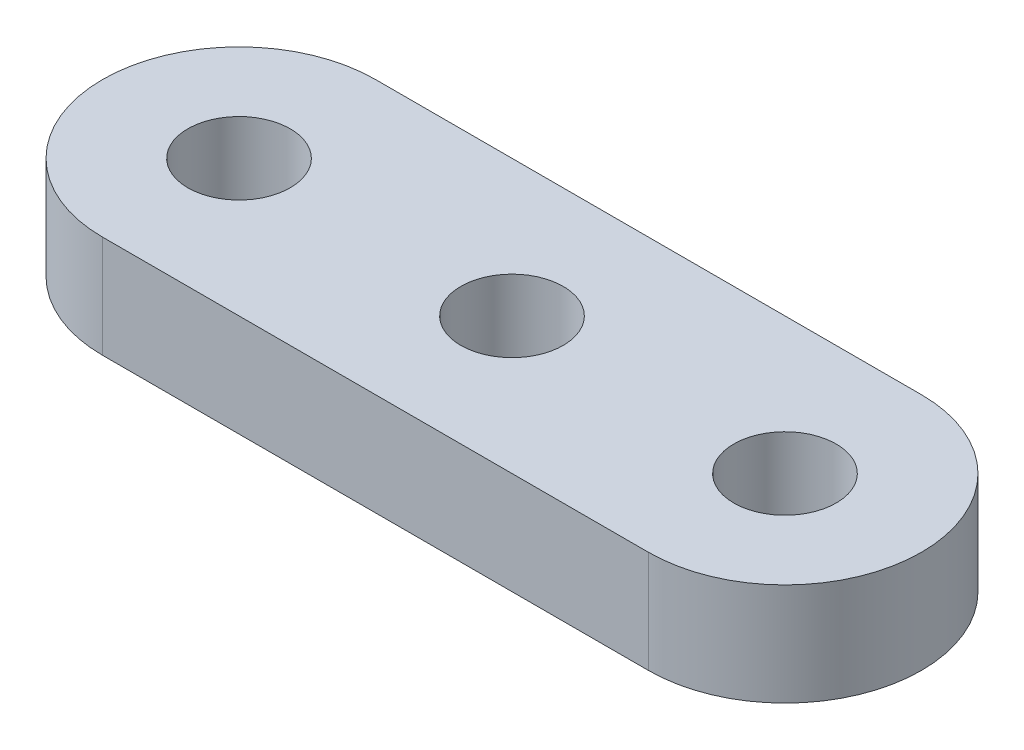
ISO-10303-21;
HEADER;
FILE_DESCRIPTION(('STEP AP214'),'2;1');
FILE_NAME('part.step','',(''),(''),'','','');
FILE_SCHEMA(('AUTOMOTIVE_DESIGN { 1 0 10303 214 1 1 1 1 }'));
ENDSEC;
DATA;
#1=APPLICATION_CONTEXT('core data for automotive mechanical design processes');
#2=APPLICATION_PROTOCOL_DEFINITION('international standard','automotive_design',2000,#1);
#3=PRODUCT_CONTEXT('',#1,'mechanical');
#4=PRODUCT('Part','Part','',(#3));
#5=PRODUCT_RELATED_PRODUCT_CATEGORY('part','',(#4));
#6=PRODUCT_DEFINITION_FORMATION('','',#4);
#7=PRODUCT_DEFINITION_CONTEXT('part definition',#1,'design');
#8=PRODUCT_DEFINITION('design','',#6,#7);
#9=PRODUCT_DEFINITION_SHAPE('','',#8);
#10=(LENGTH_UNIT() NAMED_UNIT(*) SI_UNIT(.MILLI.,.METRE.));
#11=(NAMED_UNIT(*) PLANE_ANGLE_UNIT() SI_UNIT($,.RADIAN.));
#12=(NAMED_UNIT(*) SI_UNIT($,.STERADIAN.) SOLID_ANGLE_UNIT());
#13=UNCERTAINTY_MEASURE_WITH_UNIT(LENGTH_MEASURE(1.E-05),#10,'distance_accuracy_value','');
#14=(GEOMETRIC_REPRESENTATION_CONTEXT(3) GLOBAL_UNCERTAINTY_ASSIGNED_CONTEXT((#13)) GLOBAL_UNIT_ASSIGNED_CONTEXT((#10,
#11,#12)) REPRESENTATION_CONTEXT('',''));
#15=CARTESIAN_POINT('',(0.,0.,0.));
#16=DIRECTION('',(0.,0.,1.));
#17=DIRECTION('',(1.,0.,0.));
#18=AXIS2_PLACEMENT_3D('',#15,#16,#17);
#19=CARTESIAN_POINT('',(0.,3.,0.));
#20=DIRECTION('',(0.,1.,0.));
#21=DIRECTION('',(0.,0.,1.));
#22=AXIS2_PLACEMENT_3D('',#19,#20,#21);
#23=PLANE('',#22);
#24=CARTESIAN_POINT('',(8.00000000000001,3.,0.));
#25=DIRECTION('',(0.,1.,0.));
#26=DIRECTION('',(0.,0.,1.));
#27=AXIS2_PLACEMENT_3D('',#24,#25,#26);
#28=CIRCLE('',#27,1.5);
#29=CARTESIAN_POINT('',(8.00000000000001,3.,1.5));
#30=VERTEX_POINT('',#29);
#31=EDGE_CURVE('E128',#30,#30,#28,.T.);
#32=ORIENTED_EDGE('',*,*,#31,.F.);
#33=EDGE_LOOP('',(#32));
#34=FACE_BOUND('',#33,.T.);
#35=CARTESIAN_POINT('',(0.,3.,0.));
#36=DIRECTION('',(0.,1.,0.));
#37=DIRECTION('',(0.,0.,1.));
#38=AXIS2_PLACEMENT_3D('',#35,#36,#37);
#39=CIRCLE('',#38,4.);
#40=CARTESIAN_POINT('',(0.,3.,-4.));
#41=VERTEX_POINT('',#40);
#42=CARTESIAN_POINT('',(0.,3.,4.));
#43=VERTEX_POINT('',#42);
#44=EDGE_CURVE('E98',#41,#43,#39,.T.);
#45=ORIENTED_EDGE('',*,*,#44,.T.);
#46=DIRECTION('',(1.,0.,0.));
#47=VECTOR('',#46,1.);
#48=CARTESIAN_POINT('',(0.,3.,4.));
#49=LINE('',#48,#47);
#50=CARTESIAN_POINT('',(16.,3.,4.));
#51=VERTEX_POINT('',#50);
#52=EDGE_CURVE('E93',#43,#51,#49,.T.);
#53=ORIENTED_EDGE('',*,*,#52,.T.);
#54=CARTESIAN_POINT('',(16.,3.,0.));
#55=DIRECTION('',(0.,1.,0.));
#56=DIRECTION('',(0.,0.,1.));
#57=AXIS2_PLACEMENT_3D('',#54,#55,#56);
#58=CIRCLE('',#57,4.);
#59=CARTESIAN_POINT('',(16.,3.,-4.));
#60=VERTEX_POINT('',#59);
#61=EDGE_CURVE('E96',#51,#60,#58,.T.);
#62=ORIENTED_EDGE('',*,*,#61,.T.);
#63=DIRECTION('',(-1.,0.,0.));
#64=VECTOR('',#63,1.);
#65=CARTESIAN_POINT('',(0.,3.,-4.));
#66=LINE('',#65,#64);
#67=EDGE_CURVE('E63',#60,#41,#66,.T.);
#68=ORIENTED_EDGE('',*,*,#67,.T.);
#69=EDGE_LOOP('',(#45,#53,#62,#68));
#70=FACE_BOUND('',#69,.T.);
#71=CARTESIAN_POINT('',(0.,3.,0.));
#72=DIRECTION('',(0.,1.,0.));
#73=DIRECTION('',(0.,0.,1.));
#74=AXIS2_PLACEMENT_3D('',#71,#72,#73);
#75=CIRCLE('',#74,1.5);
#76=CARTESIAN_POINT('',(0.,3.,1.5));
#77=VERTEX_POINT('',#76);
#78=EDGE_CURVE('E113',#77,#77,#75,.T.);
#79=ORIENTED_EDGE('',*,*,#78,.F.);
#80=EDGE_LOOP('',(#79));
#81=FACE_BOUND('',#80,.T.);
#82=CARTESIAN_POINT('',(16.,3.,0.));
#83=DIRECTION('',(0.,1.,0.));
#84=DIRECTION('',(0.,0.,1.));
#85=AXIS2_PLACEMENT_3D('',#82,#83,#84);
#86=CIRCLE('',#85,1.5);
#87=CARTESIAN_POINT('',(16.,3.,1.50000000000001));
#88=VERTEX_POINT('',#87);
#89=EDGE_CURVE('E134',#88,#88,#86,.T.);
#90=ORIENTED_EDGE('',*,*,#89,.F.);
#91=EDGE_LOOP('',(#90));
#92=FACE_BOUND('',#91,.T.);
#93=ADVANCED_FACE('F46',(#34,#70,#81,#92),#23,.T.);
#94=CARTESIAN_POINT('',(0.,0.,0.));
#95=DIRECTION('',(0.,1.,0.));
#96=DIRECTION('',(0.,0.,1.));
#97=AXIS2_PLACEMENT_3D('',#94,#95,#96);
#98=PLANE('',#97);
#99=CARTESIAN_POINT('',(8.00000000000001,0.,0.));
#100=DIRECTION('',(0.,1.,0.));
#101=DIRECTION('',(0.,0.,1.));
#102=AXIS2_PLACEMENT_3D('',#99,#100,#101);
#103=CIRCLE('',#102,1.5);
#104=CARTESIAN_POINT('',(8.00000000000001,0.,1.5));
#105=VERTEX_POINT('',#104);
#106=EDGE_CURVE('E131',#105,#105,#103,.T.);
#107=ORIENTED_EDGE('',*,*,#106,.T.);
#108=EDGE_LOOP('',(#107));
#109=FACE_BOUND('',#108,.T.);
#110=CARTESIAN_POINT('',(0.,0.,0.));
#111=DIRECTION('',(0.,1.,0.));
#112=DIRECTION('',(0.,0.,1.));
#113=AXIS2_PLACEMENT_3D('',#110,#111,#112);
#114=CIRCLE('',#113,4.);
#115=CARTESIAN_POINT('',(0.,0.,-4.));
#116=VERTEX_POINT('',#115);
#117=CARTESIAN_POINT('',(0.,0.,4.));
#118=VERTEX_POINT('',#117);
#119=EDGE_CURVE('E110',#116,#118,#114,.T.);
#120=ORIENTED_EDGE('',*,*,#119,.F.);
#121=DIRECTION('',(-1.,0.,0.));
#122=VECTOR('',#121,1.);
#123=CARTESIAN_POINT('',(0.,0.,-4.));
#124=LINE('',#123,#122);
#125=CARTESIAN_POINT('',(16.,0.,-4.));
#126=VERTEX_POINT('',#125);
#127=EDGE_CURVE('E86',#126,#116,#124,.T.);
#128=ORIENTED_EDGE('',*,*,#127,.F.);
#129=CARTESIAN_POINT('',(16.,0.,0.));
#130=DIRECTION('',(0.,1.,0.));
#131=DIRECTION('',(0.,0.,1.));
#132=AXIS2_PLACEMENT_3D('',#129,#130,#131);
#133=CIRCLE('',#132,4.);
#134=CARTESIAN_POINT('',(16.,0.,4.));
#135=VERTEX_POINT('',#134);
#136=EDGE_CURVE('E80',#135,#126,#133,.T.);
#137=ORIENTED_EDGE('',*,*,#136,.F.);
#138=DIRECTION('',(1.,0.,0.));
#139=VECTOR('',#138,1.);
#140=CARTESIAN_POINT('',(0.,0.,4.));
#141=LINE('',#140,#139);
#142=EDGE_CURVE('E102',#118,#135,#141,.T.);
#143=ORIENTED_EDGE('',*,*,#142,.F.);
#144=EDGE_LOOP('',(#120,#128,#137,#143));
#145=FACE_BOUND('',#144,.T.);
#146=CARTESIAN_POINT('',(0.,0.,0.));
#147=DIRECTION('',(0.,1.,0.));
#148=DIRECTION('',(0.,0.,1.));
#149=AXIS2_PLACEMENT_3D('',#146,#147,#148);
#150=CIRCLE('',#149,1.5);
#151=CARTESIAN_POINT('',(0.,0.,1.5));
#152=VERTEX_POINT('',#151);
#153=EDGE_CURVE('E125',#152,#152,#150,.T.);
#154=ORIENTED_EDGE('',*,*,#153,.T.);
#155=EDGE_LOOP('',(#154));
#156=FACE_BOUND('',#155,.T.);
#157=CARTESIAN_POINT('',(16.,0.,0.));
#158=DIRECTION('',(0.,1.,0.));
#159=DIRECTION('',(0.,0.,1.));
#160=AXIS2_PLACEMENT_3D('',#157,#158,#159);
#161=CIRCLE('',#160,1.5);
#162=CARTESIAN_POINT('',(16.,0.,1.50000000000001));
#163=VERTEX_POINT('',#162);
#164=EDGE_CURVE('E137',#163,#163,#161,.T.);
#165=ORIENTED_EDGE('',*,*,#164,.T.);
#166=EDGE_LOOP('',(#165));
#167=FACE_BOUND('',#166,.T.);
#168=ADVANCED_FACE('F121',(#109,#145,#156,#167),#98,.F.);
#169=CARTESIAN_POINT('',(0.,3.,0.));
#170=DIRECTION('',(0.,-1.,0.));
#171=DIRECTION('',(0.,0.,-1.));
#172=AXIS2_PLACEMENT_3D('',#169,#170,#171);
#173=CYLINDRICAL_SURFACE('',#172,4.);
#174=ORIENTED_EDGE('',*,*,#119,.T.);
#175=DIRECTION('',(0.,-1.,0.));
#176=VECTOR('',#175,1.);
#177=CARTESIAN_POINT('',(0.,3.,4.));
#178=LINE('',#177,#176);
#179=EDGE_CURVE('E13',#43,#118,#178,.T.);
#180=ORIENTED_EDGE('',*,*,#179,.F.);
#181=ORIENTED_EDGE('',*,*,#44,.F.);
#182=DIRECTION('',(0.,-1.,0.));
#183=VECTOR('',#182,1.);
#184=CARTESIAN_POINT('',(0.,3.,-4.));
#185=LINE('',#184,#183);
#186=EDGE_CURVE('E106',#41,#116,#185,.T.);
#187=ORIENTED_EDGE('',*,*,#186,.T.);
#188=EDGE_LOOP('',(#174,#180,#181,#187));
#189=FACE_BOUND('',#188,.T.);
#190=ADVANCED_FACE('F48',(#189),#173,.T.);
#191=CARTESIAN_POINT('',(0.,3.,4.));
#192=DIRECTION('',(0.,0.,-1.));
#193=DIRECTION('',(-1.,0.,0.));
#194=AXIS2_PLACEMENT_3D('',#191,#192,#193);
#195=PLANE('',#194);
#196=ORIENTED_EDGE('',*,*,#142,.T.);
#197=DIRECTION('',(0.,-1.,0.));
#198=VECTOR('',#197,1.);
#199=CARTESIAN_POINT('',(16.,3.,4.));
#200=LINE('',#199,#198);
#201=EDGE_CURVE('E55',#51,#135,#200,.T.);
#202=ORIENTED_EDGE('',*,*,#201,.F.);
#203=ORIENTED_EDGE('',*,*,#52,.F.);
#204=ORIENTED_EDGE('',*,*,#179,.T.);
#205=EDGE_LOOP('',(#196,#202,#203,#204));
#206=FACE_BOUND('',#205,.T.);
#207=ADVANCED_FACE('F101',(#206),#195,.F.);
#208=CARTESIAN_POINT('',(16.,3.,0.));
#209=DIRECTION('',(0.,-1.,0.));
#210=DIRECTION('',(0.,0.,-1.));
#211=AXIS2_PLACEMENT_3D('',#208,#209,#210);
#212=CYLINDRICAL_SURFACE('',#211,4.);
#213=ORIENTED_EDGE('',*,*,#136,.T.);
#214=DIRECTION('',(0.,-1.,0.));
#215=VECTOR('',#214,1.);
#216=CARTESIAN_POINT('',(16.,3.,-4.));
#217=LINE('',#216,#215);
#218=EDGE_CURVE('E103',#60,#126,#217,.T.);
#219=ORIENTED_EDGE('',*,*,#218,.F.);
#220=ORIENTED_EDGE('',*,*,#61,.F.);
#221=ORIENTED_EDGE('',*,*,#201,.T.);
#222=EDGE_LOOP('',(#213,#219,#220,#221));
#223=FACE_BOUND('',#222,.T.);
#224=ADVANCED_FACE('F104',(#223),#212,.T.);
#225=CARTESIAN_POINT('',(0.,3.,-4.));
#226=DIRECTION('',(0.,0.,1.));
#227=DIRECTION('',(1.,0.,0.));
#228=AXIS2_PLACEMENT_3D('',#225,#226,#227);
#229=PLANE('',#228);
#230=ORIENTED_EDGE('',*,*,#127,.T.);
#231=ORIENTED_EDGE('',*,*,#186,.F.);
#232=ORIENTED_EDGE('',*,*,#67,.F.);
#233=ORIENTED_EDGE('',*,*,#218,.T.);
#234=EDGE_LOOP('',(#230,#231,#232,#233));
#235=FACE_BOUND('',#234,.T.);
#236=ADVANCED_FACE('F118',(#235),#229,.F.);
#237=CARTESIAN_POINT('',(0.,3.,0.));
#238=DIRECTION('',(0.,-1.,0.));
#239=DIRECTION('',(0.,0.,-1.));
#240=AXIS2_PLACEMENT_3D('',#237,#238,#239);
#241=CYLINDRICAL_SURFACE('',#240,1.5);
#242=ORIENTED_EDGE('',*,*,#78,.T.);
#243=EDGE_LOOP('',(#242));
#244=FACE_BOUND('',#243,.T.);
#245=ORIENTED_EDGE('',*,*,#153,.F.);
#246=EDGE_LOOP('',(#245));
#247=FACE_BOUND('',#246,.T.);
#248=ADVANCED_FACE('F156',(#244,#247),#241,.F.);
#249=CARTESIAN_POINT('',(8.00000000000001,3.,0.));
#250=DIRECTION('',(0.,-1.,0.));
#251=DIRECTION('',(0.,0.,-1.));
#252=AXIS2_PLACEMENT_3D('',#249,#250,#251);
#253=CYLINDRICAL_SURFACE('',#252,1.5);
#254=ORIENTED_EDGE('',*,*,#31,.T.);
#255=EDGE_LOOP('',(#254));
#256=FACE_BOUND('',#255,.T.);
#257=ORIENTED_EDGE('',*,*,#106,.F.);
#258=EDGE_LOOP('',(#257));
#259=FACE_BOUND('',#258,.T.);
#260=ADVANCED_FACE('F191',(#256,#259),#253,.F.);
#261=CARTESIAN_POINT('',(16.,3.,0.));
#262=DIRECTION('',(0.,-1.,0.));
#263=DIRECTION('',(0.,0.,-1.));
#264=AXIS2_PLACEMENT_3D('',#261,#262,#263);
#265=CYLINDRICAL_SURFACE('',#264,1.5);
#266=ORIENTED_EDGE('',*,*,#89,.T.);
#267=EDGE_LOOP('',(#266));
#268=FACE_BOUND('',#267,.T.);
#269=ORIENTED_EDGE('',*,*,#164,.F.);
#270=EDGE_LOOP('',(#269));
#271=FACE_BOUND('',#270,.T.);
#272=ADVANCED_FACE('F143',(#268,#271),#265,.F.);
#273=CLOSED_SHELL('',(#93,#168,#190,#207,#224,#236,#248,#260,#272));
#274=MANIFOLD_SOLID_BREP('B2',#273);
#275=ADVANCED_BREP_SHAPE_REPRESENTATION('',(#18,#274),#14);
#276=SHAPE_DEFINITION_REPRESENTATION(#9,#275);
ENDSEC;
END-ISO-10303-21;
